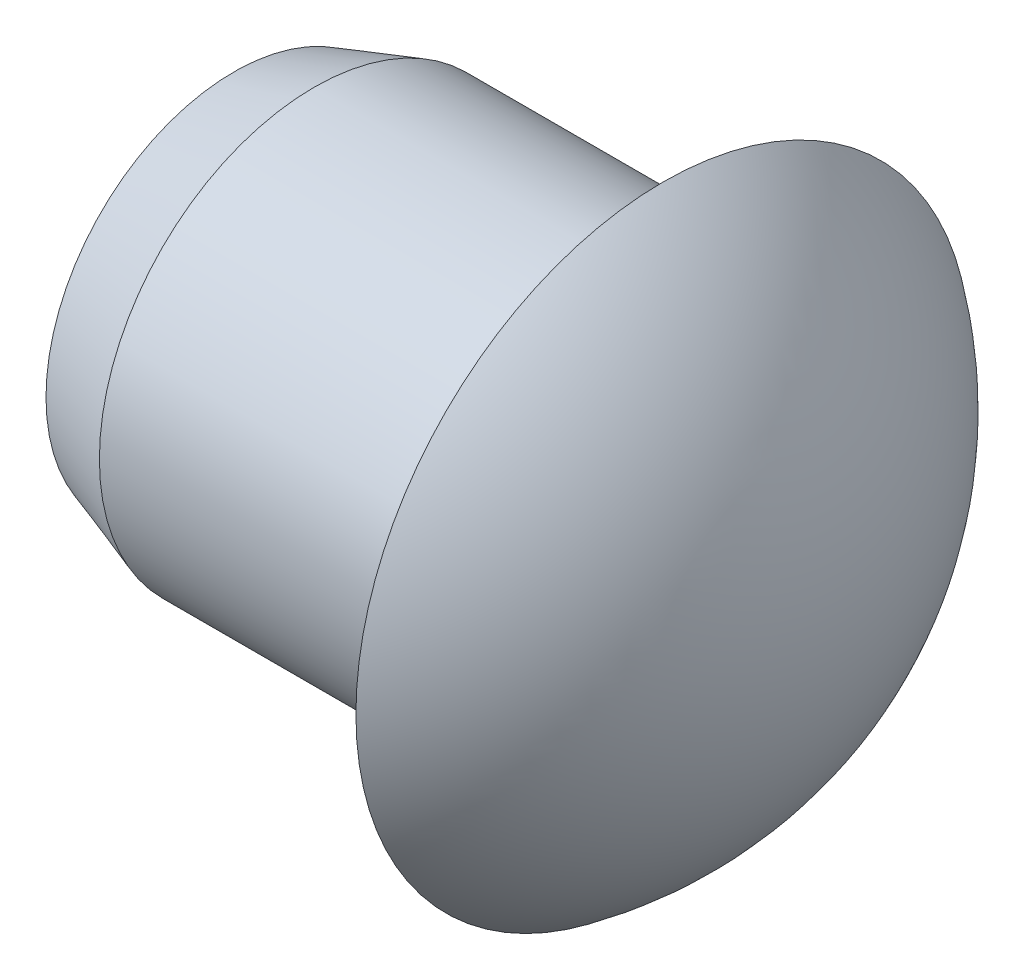
ISO-10303-21;
HEADER;
FILE_DESCRIPTION(('STEP AP214'),'2;1');
FILE_NAME('part.step','',(''),(''),'','','');
FILE_SCHEMA(('AUTOMOTIVE_DESIGN { 1 0 10303 214 1 1 1 1 }'));
ENDSEC;
DATA;
#1=APPLICATION_CONTEXT('core data for automotive mechanical design processes');
#2=APPLICATION_PROTOCOL_DEFINITION('international standard','automotive_design',2000,#1);
#3=PRODUCT_CONTEXT('',#1,'mechanical');
#4=PRODUCT('Part','Part','',(#3));
#5=PRODUCT_RELATED_PRODUCT_CATEGORY('part','',(#4));
#6=PRODUCT_DEFINITION_FORMATION('','',#4);
#7=PRODUCT_DEFINITION_CONTEXT('part definition',#1,'design');
#8=PRODUCT_DEFINITION('design','',#6,#7);
#9=PRODUCT_DEFINITION_SHAPE('','',#8);
#10=(LENGTH_UNIT() NAMED_UNIT(*) SI_UNIT(.MILLI.,.METRE.));
#11=(NAMED_UNIT(*) PLANE_ANGLE_UNIT() SI_UNIT($,.RADIAN.));
#12=(NAMED_UNIT(*) SI_UNIT($,.STERADIAN.) SOLID_ANGLE_UNIT());
#13=UNCERTAINTY_MEASURE_WITH_UNIT(LENGTH_MEASURE(1.E-05),#10,'distance_accuracy_value','');
#14=(GEOMETRIC_REPRESENTATION_CONTEXT(3) GLOBAL_UNCERTAINTY_ASSIGNED_CONTEXT((#13)) GLOBAL_UNIT_ASSIGNED_CONTEXT((#10,
#11,#12)) REPRESENTATION_CONTEXT('',''));
#15=CARTESIAN_POINT('',(0.,0.,0.));
#16=DIRECTION('',(0.,0.,1.));
#17=DIRECTION('',(1.,0.,0.));
#18=AXIS2_PLACEMENT_3D('',#15,#16,#17);
#19=CARTESIAN_POINT('',(3.93175212701618,0.,0.));
#20=DIRECTION('',(-1.,0.,0.));
#21=DIRECTION('',(0.,1.,0.));
#22=AXIS2_PLACEMENT_3D('',#19,#20,#21);
#23=SPHERICAL_SURFACE('',#22,7.02437682223068);
#24=CARTESIAN_POINT('',(8.,0.,0.));
#25=DIRECTION('',(-1.,0.,0.));
#26=DIRECTION('',(0.,0.,1.));
#27=AXIS2_PLACEMENT_3D('',#24,#25,#26);
#28=CIRCLE('',#27,5.72636263125679);
#29=CARTESIAN_POINT('',(8.,0.,5.72636263125679));
#30=VERTEX_POINT('',#29);
#31=EDGE_CURVE('E55',#30,#30,#28,.T.);
#32=ORIENTED_EDGE('',*,*,#31,.F.);
#33=EDGE_LOOP('',(#32));
#34=FACE_BOUND('',#33,.T.);
#35=ADVANCED_FACE('F33',(#34),#23,.T.);
#36=CARTESIAN_POINT('',(8.,2.5,0.));
#37=DIRECTION('',(1.,0.,0.));
#38=DIRECTION('',(0.,0.,-1.));
#39=AXIS2_PLACEMENT_3D('',#36,#37,#38);
#40=PLANE('',#39);
#41=CARTESIAN_POINT('',(8.,0.,0.));
#42=DIRECTION('',(-1.,0.,0.));
#43=DIRECTION('',(0.,0.,1.));
#44=AXIS2_PLACEMENT_3D('',#41,#42,#43);
#45=CIRCLE('',#44,2.5);
#46=CARTESIAN_POINT('',(8.,0.,2.5));
#47=VERTEX_POINT('',#46);
#48=EDGE_CURVE('E10',#47,#47,#45,.T.);
#49=ORIENTED_EDGE('',*,*,#48,.T.);
#50=EDGE_LOOP('',(#49));
#51=FACE_BOUND('',#50,.T.);
#52=ADVANCED_FACE('F62',(#51),#40,.F.);
#53=CARTESIAN_POINT('',(0.,0.,0.));
#54=DIRECTION('',(-1.,0.,0.));
#55=DIRECTION('',(0.,0.,1.));
#56=AXIS2_PLACEMENT_3D('',#53,#54,#55);
#57=CYLINDRICAL_SURFACE('',#56,2.5);
#58=ORIENTED_EDGE('',*,*,#48,.F.);
#59=EDGE_LOOP('',(#58));
#60=FACE_BOUND('',#59,.T.);
#61=CARTESIAN_POINT('',(0.,0.,0.));
#62=DIRECTION('',(-1.,0.,0.));
#63=DIRECTION('',(0.,0.,1.));
#64=AXIS2_PLACEMENT_3D('',#61,#62,#63);
#65=CIRCLE('',#64,2.5);
#66=CARTESIAN_POINT('',(0.,0.,2.5));
#67=VERTEX_POINT('',#66);
#68=EDGE_CURVE('E39',#67,#67,#65,.T.);
#69=ORIENTED_EDGE('',*,*,#68,.T.);
#70=EDGE_LOOP('',(#69));
#71=FACE_BOUND('',#70,.T.);
#72=ADVANCED_FACE('F66',(#60,#71),#57,.F.);
#73=CARTESIAN_POINT('',(0.,2.5,0.));
#74=DIRECTION('',(1.,0.,0.));
#75=DIRECTION('',(0.,0.,-1.));
#76=AXIS2_PLACEMENT_3D('',#73,#74,#75);
#77=PLANE('',#76);
#78=ORIENTED_EDGE('',*,*,#68,.F.);
#79=EDGE_LOOP('',(#78));
#80=FACE_BOUND('',#79,.T.);
#81=CARTESIAN_POINT('',(0.,0.,0.));
#82=DIRECTION('',(-1.,0.,0.));
#83=DIRECTION('',(0.,0.,1.));
#84=AXIS2_PLACEMENT_3D('',#81,#82,#83);
#85=CIRCLE('',#84,3.5);
#86=CARTESIAN_POINT('',(0.,0.,3.5));
#87=VERTEX_POINT('',#86);
#88=EDGE_CURVE('E43',#87,#87,#85,.T.);
#89=ORIENTED_EDGE('',*,*,#88,.T.);
#90=EDGE_LOOP('',(#89));
#91=FACE_BOUND('',#90,.T.);
#92=ADVANCED_FACE('F70',(#80,#91),#77,.F.);
#93=CARTESIAN_POINT('',(1.49455903906793,0.,0.));
#94=DIRECTION('',(1.,0.,0.));
#95=DIRECTION('',(0.,0.,-1.));
#96=AXIS2_PLACEMENT_3D('',#93,#94,#95);
#97=CONICAL_SURFACE('',#96,4.,0.322842310271343);
#98=ORIENTED_EDGE('',*,*,#88,.F.);
#99=EDGE_LOOP('',(#98));
#100=FACE_BOUND('',#99,.T.);
#101=CARTESIAN_POINT('',(1.49455903906793,0.,0.));
#102=DIRECTION('',(-1.,0.,0.));
#103=DIRECTION('',(0.,0.,1.));
#104=AXIS2_PLACEMENT_3D('',#101,#102,#103);
#105=CIRCLE('',#104,4.);
#106=CARTESIAN_POINT('',(1.49455903906793,0.,4.));
#107=VERTEX_POINT('',#106);
#108=EDGE_CURVE('E47',#107,#107,#105,.T.);
#109=ORIENTED_EDGE('',*,*,#108,.T.);
#110=EDGE_LOOP('',(#109));
#111=FACE_BOUND('',#110,.T.);
#112=ADVANCED_FACE('F76',(#100,#111),#97,.T.);
#113=CARTESIAN_POINT('',(0.,0.,0.));
#114=DIRECTION('',(-1.,0.,0.));
#115=DIRECTION('',(0.,0.,1.));
#116=AXIS2_PLACEMENT_3D('',#113,#114,#115);
#117=CYLINDRICAL_SURFACE('',#116,4.);
#118=ORIENTED_EDGE('',*,*,#108,.F.);
#119=EDGE_LOOP('',(#118));
#120=FACE_BOUND('',#119,.T.);
#121=CARTESIAN_POINT('',(8.,0.,0.));
#122=DIRECTION('',(-1.,0.,0.));
#123=DIRECTION('',(0.,0.,1.));
#124=AXIS2_PLACEMENT_3D('',#121,#122,#123);
#125=CIRCLE('',#124,4.);
#126=CARTESIAN_POINT('',(8.,0.,4.));
#127=VERTEX_POINT('',#126);
#128=EDGE_CURVE('E52',#127,#127,#125,.T.);
#129=ORIENTED_EDGE('',*,*,#128,.T.);
#130=EDGE_LOOP('',(#129));
#131=FACE_BOUND('',#130,.T.);
#132=ADVANCED_FACE('F80',(#120,#131),#117,.T.);
#133=CARTESIAN_POINT('',(8.,4.,0.));
#134=DIRECTION('',(1.,0.,0.));
#135=DIRECTION('',(0.,0.,-1.));
#136=AXIS2_PLACEMENT_3D('',#133,#134,#135);
#137=PLANE('',#136);
#138=ORIENTED_EDGE('',*,*,#128,.F.);
#139=EDGE_LOOP('',(#138));
#140=FACE_BOUND('',#139,.T.);
#141=ORIENTED_EDGE('',*,*,#31,.T.);
#142=EDGE_LOOP('',(#141));
#143=FACE_BOUND('',#142,.T.);
#144=ADVANCED_FACE('F59',(#140,#143),#137,.F.);
#145=CLOSED_SHELL('',(#35,#52,#72,#92,#112,#132,#144));
#146=MANIFOLD_SOLID_BREP('B2',#145);
#147=ADVANCED_BREP_SHAPE_REPRESENTATION('',(#18,#146),#14);
#148=SHAPE_DEFINITION_REPRESENTATION(#9,#147);
ENDSEC;
END-ISO-10303-21;
